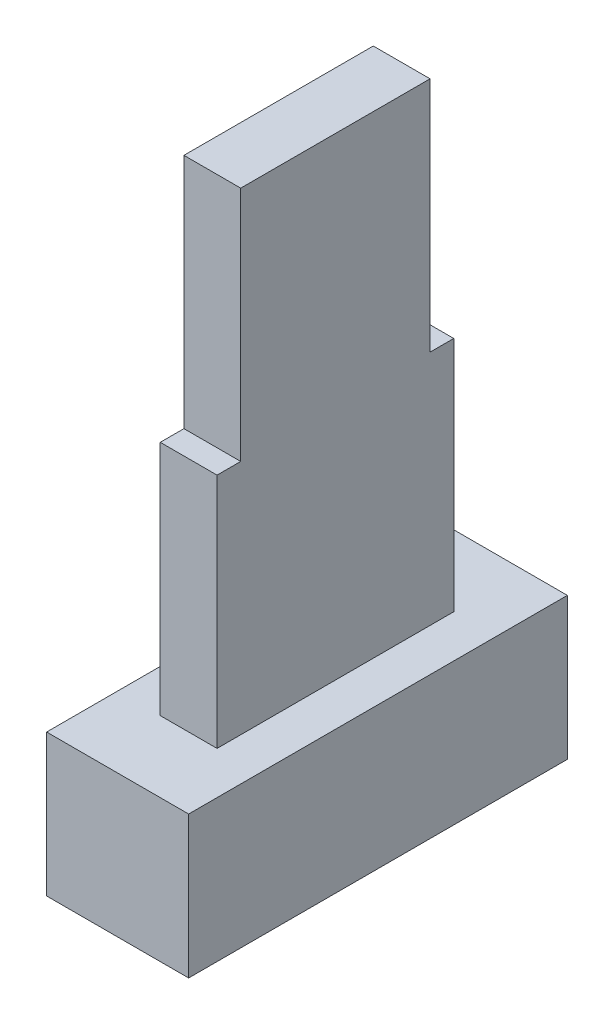
ISO-10303-21;
HEADER;
FILE_DESCRIPTION(('STEP AP214'),'2;1');
FILE_NAME('part.step','',(''),(''),'','','');
FILE_SCHEMA(('AUTOMOTIVE_DESIGN { 1 0 10303 214 1 1 1 1 }'));
ENDSEC;
DATA;
#1=APPLICATION_CONTEXT('core data for automotive mechanical design processes');
#2=APPLICATION_PROTOCOL_DEFINITION('international standard','automotive_design',2000,#1);
#3=PRODUCT_CONTEXT('',#1,'mechanical');
#4=PRODUCT('Part','Part','',(#3));
#5=PRODUCT_RELATED_PRODUCT_CATEGORY('part','',(#4));
#6=PRODUCT_DEFINITION_FORMATION('','',#4);
#7=PRODUCT_DEFINITION_CONTEXT('part definition',#1,'design');
#8=PRODUCT_DEFINITION('design','',#6,#7);
#9=PRODUCT_DEFINITION_SHAPE('','',#8);
#10=(LENGTH_UNIT() NAMED_UNIT(*) SI_UNIT(.MILLI.,.METRE.));
#11=(NAMED_UNIT(*) PLANE_ANGLE_UNIT() SI_UNIT($,.RADIAN.));
#12=(NAMED_UNIT(*) SI_UNIT($,.STERADIAN.) SOLID_ANGLE_UNIT());
#13=UNCERTAINTY_MEASURE_WITH_UNIT(LENGTH_MEASURE(1.E-05),#10,'distance_accuracy_value','');
#14=(GEOMETRIC_REPRESENTATION_CONTEXT(3) GLOBAL_UNCERTAINTY_ASSIGNED_CONTEXT((#13)) GLOBAL_UNIT_ASSIGNED_CONTEXT((#10,
#11,#12)) REPRESENTATION_CONTEXT('',''));
#15=CARTESIAN_POINT('',(0.,0.,0.));
#16=DIRECTION('',(0.,0.,1.));
#17=DIRECTION('',(1.,0.,0.));
#18=AXIS2_PLACEMENT_3D('',#15,#16,#17);
#19=CARTESIAN_POINT('',(0.,8.,0.));
#20=DIRECTION('',(0.,1.,0.));
#21=DIRECTION('',(0.,0.,1.));
#22=AXIS2_PLACEMENT_3D('',#19,#20,#21);
#23=PLANE('',#22);
#24=DIRECTION('',(-1.,0.,0.));
#25=VECTOR('',#24,1.);
#26=CARTESIAN_POINT('',(0.6,8.,-2.));
#27=LINE('',#26,#25);
#28=CARTESIAN_POINT('',(0.6,8.,-2.));
#29=VERTEX_POINT('',#28);
#30=CARTESIAN_POINT('',(-0.6,8.,-2.));
#31=VERTEX_POINT('',#30);
#32=EDGE_CURVE('E48',#29,#31,#27,.T.);
#33=ORIENTED_EDGE('',*,*,#32,.F.);
#34=DIRECTION('',(0.,0.,-1.));
#35=VECTOR('',#34,1.);
#36=CARTESIAN_POINT('',(0.6,8.,2.5));
#37=LINE('',#36,#35);
#38=CARTESIAN_POINT('',(0.6,8.,-2.5));
#39=VERTEX_POINT('',#38);
#40=EDGE_CURVE('E158',#29,#39,#37,.T.);
#41=ORIENTED_EDGE('',*,*,#40,.T.);
#42=DIRECTION('',(-1.,0.,0.));
#43=VECTOR('',#42,1.);
#44=CARTESIAN_POINT('',(0.6,8.,-2.5));
#45=LINE('',#44,#43);
#46=CARTESIAN_POINT('',(-0.6,8.,-2.5));
#47=VERTEX_POINT('',#46);
#48=EDGE_CURVE('E161',#39,#47,#45,.T.);
#49=ORIENTED_EDGE('',*,*,#48,.T.);
#50=DIRECTION('',(0.,0.,1.));
#51=VECTOR('',#50,1.);
#52=CARTESIAN_POINT('',(-0.6,8.,2.5));
#53=LINE('',#52,#51);
#54=EDGE_CURVE('E154',#47,#31,#53,.T.);
#55=ORIENTED_EDGE('',*,*,#54,.T.);
#56=EDGE_LOOP('',(#33,#41,#49,#55));
#57=FACE_BOUND('',#56,.T.);
#58=ADVANCED_FACE('F33',(#57),#23,.T.);
#59=CARTESIAN_POINT('',(0.,3.,0.));
#60=DIRECTION('',(0.,-1.,0.));
#61=DIRECTION('',(0.,0.,-1.));
#62=AXIS2_PLACEMENT_3D('',#59,#60,#61);
#63=PLANE('',#62);
#64=DIRECTION('',(0.,0.,-1.));
#65=VECTOR('',#64,1.);
#66=CARTESIAN_POINT('',(1.5,3.,4.));
#67=LINE('',#66,#65);
#68=CARTESIAN_POINT('',(1.5,3.,4.));
#69=VERTEX_POINT('',#68);
#70=CARTESIAN_POINT('',(1.5,3.,-4.));
#71=VERTEX_POINT('',#70);
#72=EDGE_CURVE('E184',#69,#71,#67,.T.);
#73=ORIENTED_EDGE('',*,*,#72,.T.);
#74=DIRECTION('',(-1.,0.,0.));
#75=VECTOR('',#74,1.);
#76=CARTESIAN_POINT('',(-1.5,3.,-4.));
#77=LINE('',#76,#75);
#78=CARTESIAN_POINT('',(-1.5,3.,-4.));
#79=VERTEX_POINT('',#78);
#80=EDGE_CURVE('E187',#71,#79,#77,.T.);
#81=ORIENTED_EDGE('',*,*,#80,.T.);
#82=DIRECTION('',(0.,0.,1.));
#83=VECTOR('',#82,1.);
#84=CARTESIAN_POINT('',(-1.5,3.,4.));
#85=LINE('',#84,#83);
#86=CARTESIAN_POINT('',(-1.5,3.,4.));
#87=VERTEX_POINT('',#86);
#88=EDGE_CURVE('E190',#79,#87,#85,.T.);
#89=ORIENTED_EDGE('',*,*,#88,.T.);
#90=DIRECTION('',(1.,0.,0.));
#91=VECTOR('',#90,1.);
#92=CARTESIAN_POINT('',(-1.5,3.,4.));
#93=LINE('',#92,#91);
#94=EDGE_CURVE('E192',#87,#69,#93,.T.);
#95=ORIENTED_EDGE('',*,*,#94,.T.);
#96=EDGE_LOOP('',(#73,#81,#89,#95));
#97=FACE_BOUND('',#96,.T.);
#98=DIRECTION('',(0.,0.,1.));
#99=VECTOR('',#98,1.);
#100=CARTESIAN_POINT('',(-0.6,3.,2.5));
#101=LINE('',#100,#99);
#102=CARTESIAN_POINT('',(-0.6,3.,-2.5));
#103=VERTEX_POINT('',#102);
#104=CARTESIAN_POINT('',(-0.6,3.,2.5));
#105=VERTEX_POINT('',#104);
#106=EDGE_CURVE('E146',#103,#105,#101,.T.);
#107=ORIENTED_EDGE('',*,*,#106,.F.);
#108=DIRECTION('',(-1.,0.,0.));
#109=VECTOR('',#108,1.);
#110=CARTESIAN_POINT('',(0.6,3.,-2.5));
#111=LINE('',#110,#109);
#112=CARTESIAN_POINT('',(0.6,3.,-2.5));
#113=VERTEX_POINT('',#112);
#114=EDGE_CURVE('E169',#113,#103,#111,.T.);
#115=ORIENTED_EDGE('',*,*,#114,.F.);
#116=DIRECTION('',(0.,0.,-1.));
#117=VECTOR('',#116,1.);
#118=CARTESIAN_POINT('',(0.6,3.,2.5));
#119=LINE('',#118,#117);
#120=CARTESIAN_POINT('',(0.6,3.,2.5));
#121=VERTEX_POINT('',#120);
#122=EDGE_CURVE('E166',#121,#113,#119,.T.);
#123=ORIENTED_EDGE('',*,*,#122,.F.);
#124=DIRECTION('',(1.,0.,0.));
#125=VECTOR('',#124,1.);
#126=CARTESIAN_POINT('',(0.6,3.,2.5));
#127=LINE('',#126,#125);
#128=EDGE_CURVE('E148',#105,#121,#127,.T.);
#129=ORIENTED_EDGE('',*,*,#128,.F.);
#130=EDGE_LOOP('',(#107,#115,#123,#129));
#131=FACE_BOUND('',#130,.T.);
#132=ADVANCED_FACE('F226',(#97,#131),#63,.F.);
#133=CARTESIAN_POINT('',(1.5,3.,4.));
#134=DIRECTION('',(-1.,0.,0.));
#135=DIRECTION('',(0.,0.,1.));
#136=AXIS2_PLACEMENT_3D('',#133,#134,#135);
#137=PLANE('',#136);
#138=DIRECTION('',(0.,0.,-1.));
#139=VECTOR('',#138,1.);
#140=CARTESIAN_POINT('',(1.5,0.,4.));
#141=LINE('',#140,#139);
#142=CARTESIAN_POINT('',(1.5,0.,4.));
#143=VERTEX_POINT('',#142);
#144=CARTESIAN_POINT('',(1.5,0.,-4.));
#145=VERTEX_POINT('',#144);
#146=EDGE_CURVE('E183',#143,#145,#141,.T.);
#147=ORIENTED_EDGE('',*,*,#146,.T.);
#148=DIRECTION('',(0.,-1.,0.));
#149=VECTOR('',#148,1.);
#150=CARTESIAN_POINT('',(1.5,3.,-4.));
#151=LINE('',#150,#149);
#152=EDGE_CURVE('E11',#71,#145,#151,.T.);
#153=ORIENTED_EDGE('',*,*,#152,.F.);
#154=ORIENTED_EDGE('',*,*,#72,.F.);
#155=DIRECTION('',(0.,-1.,0.));
#156=VECTOR('',#155,1.);
#157=CARTESIAN_POINT('',(1.5,3.,4.));
#158=LINE('',#157,#156);
#159=EDGE_CURVE('E194',#69,#143,#158,.T.);
#160=ORIENTED_EDGE('',*,*,#159,.T.);
#161=EDGE_LOOP('',(#147,#153,#154,#160));
#162=FACE_BOUND('',#161,.T.);
#163=ADVANCED_FACE('F35',(#162),#137,.F.);
#164=CARTESIAN_POINT('',(-1.5,3.,-4.));
#165=DIRECTION('',(0.,0.,1.));
#166=DIRECTION('',(1.,0.,0.));
#167=AXIS2_PLACEMENT_3D('',#164,#165,#166);
#168=PLANE('',#167);
#169=DIRECTION('',(-1.,0.,0.));
#170=VECTOR('',#169,1.);
#171=CARTESIAN_POINT('',(-1.5,0.,-4.));
#172=LINE('',#171,#170);
#173=CARTESIAN_POINT('',(-1.5,0.,-4.));
#174=VERTEX_POINT('',#173);
#175=EDGE_CURVE('E197',#145,#174,#172,.T.);
#176=ORIENTED_EDGE('',*,*,#175,.T.);
#177=DIRECTION('',(0.,-1.,0.));
#178=VECTOR('',#177,1.);
#179=CARTESIAN_POINT('',(-1.5,3.,-4.));
#180=LINE('',#179,#178);
#181=EDGE_CURVE('E41',#79,#174,#180,.T.);
#182=ORIENTED_EDGE('',*,*,#181,.F.);
#183=ORIENTED_EDGE('',*,*,#80,.F.);
#184=ORIENTED_EDGE('',*,*,#152,.T.);
#185=EDGE_LOOP('',(#176,#182,#183,#184));
#186=FACE_BOUND('',#185,.T.);
#187=ADVANCED_FACE('F228',(#186),#168,.F.);
#188=CARTESIAN_POINT('',(-1.5,3.,4.));
#189=DIRECTION('',(1.,0.,0.));
#190=DIRECTION('',(0.,0.,-1.));
#191=AXIS2_PLACEMENT_3D('',#188,#189,#190);
#192=PLANE('',#191);
#193=DIRECTION('',(0.,0.,1.));
#194=VECTOR('',#193,1.);
#195=CARTESIAN_POINT('',(-1.5,0.,4.));
#196=LINE('',#195,#194);
#197=CARTESIAN_POINT('',(-1.5,0.,4.));
#198=VERTEX_POINT('',#197);
#199=EDGE_CURVE('E199',#174,#198,#196,.T.);
#200=ORIENTED_EDGE('',*,*,#199,.T.);
#201=DIRECTION('',(0.,-1.,0.));
#202=VECTOR('',#201,1.);
#203=CARTESIAN_POINT('',(-1.5,3.,4.));
#204=LINE('',#203,#202);
#205=EDGE_CURVE('E204',#87,#198,#204,.T.);
#206=ORIENTED_EDGE('',*,*,#205,.F.);
#207=ORIENTED_EDGE('',*,*,#88,.F.);
#208=ORIENTED_EDGE('',*,*,#181,.T.);
#209=EDGE_LOOP('',(#200,#206,#207,#208));
#210=FACE_BOUND('',#209,.T.);
#211=ADVANCED_FACE('F211',(#210),#192,.F.);
#212=CARTESIAN_POINT('',(-1.5,3.,4.));
#213=DIRECTION('',(0.,0.,-1.));
#214=DIRECTION('',(-1.,0.,0.));
#215=AXIS2_PLACEMENT_3D('',#212,#213,#214);
#216=PLANE('',#215);
#217=DIRECTION('',(1.,0.,0.));
#218=VECTOR('',#217,1.);
#219=CARTESIAN_POINT('',(-1.5,0.,4.));
#220=LINE('',#219,#218);
#221=EDGE_CURVE('E188',#198,#143,#220,.T.);
#222=ORIENTED_EDGE('',*,*,#221,.T.);
#223=ORIENTED_EDGE('',*,*,#159,.F.);
#224=ORIENTED_EDGE('',*,*,#94,.F.);
#225=ORIENTED_EDGE('',*,*,#205,.T.);
#226=EDGE_LOOP('',(#222,#223,#224,#225));
#227=FACE_BOUND('',#226,.T.);
#228=ADVANCED_FACE('F220',(#227),#216,.F.);
#229=CARTESIAN_POINT('',(0.,0.,0.));
#230=DIRECTION('',(0.,-1.,0.));
#231=DIRECTION('',(0.,0.,-1.));
#232=AXIS2_PLACEMENT_3D('',#229,#230,#231);
#233=PLANE('',#232);
#234=ORIENTED_EDGE('',*,*,#146,.F.);
#235=ORIENTED_EDGE('',*,*,#221,.F.);
#236=ORIENTED_EDGE('',*,*,#199,.F.);
#237=ORIENTED_EDGE('',*,*,#175,.F.);
#238=EDGE_LOOP('',(#234,#235,#236,#237));
#239=FACE_BOUND('',#238,.T.);
#240=ADVANCED_FACE('F217',(#239),#233,.T.);
#241=CARTESIAN_POINT('',(-0.6,8.,2.5));
#242=DIRECTION('',(1.,0.,0.));
#243=DIRECTION('',(0.,0.,-1.));
#244=AXIS2_PLACEMENT_3D('',#241,#242,#243);
#245=PLANE('',#244);
#246=ORIENTED_EDGE('',*,*,#106,.T.);
#247=DIRECTION('',(0.,-1.,0.));
#248=VECTOR('',#247,1.);
#249=CARTESIAN_POINT('',(-0.6,8.,2.5));
#250=LINE('',#249,#248);
#251=CARTESIAN_POINT('',(-0.6,8.,2.5));
#252=VERTEX_POINT('',#251);
#253=EDGE_CURVE('E180',#252,#105,#250,.T.);
#254=ORIENTED_EDGE('',*,*,#253,.F.);
#255=CARTESIAN_POINT('',(-0.6,8.,2.));
#256=VERTEX_POINT('',#255);
#257=EDGE_CURVE('E145',#256,#252,#53,.T.);
#258=ORIENTED_EDGE('',*,*,#257,.F.);
#259=DIRECTION('',(0.,-1.,0.));
#260=VECTOR('',#259,1.);
#261=CARTESIAN_POINT('',(-0.6,13.,2.));
#262=LINE('',#261,#260);
#263=CARTESIAN_POINT('',(-0.6,13.,2.));
#264=VERTEX_POINT('',#263);
#265=EDGE_CURVE('E126',#264,#256,#262,.T.);
#266=ORIENTED_EDGE('',*,*,#265,.F.);
#267=DIRECTION('',(0.,0.,1.));
#268=VECTOR('',#267,1.);
#269=CARTESIAN_POINT('',(-0.6,13.,2.));
#270=LINE('',#269,#268);
#271=CARTESIAN_POINT('',(-0.6,13.,-2.));
#272=VERTEX_POINT('',#271);
#273=EDGE_CURVE('E132',#272,#264,#270,.T.);
#274=ORIENTED_EDGE('',*,*,#273,.F.);
#275=DIRECTION('',(0.,-1.,0.));
#276=VECTOR('',#275,1.);
#277=CARTESIAN_POINT('',(-0.6,13.,-2.));
#278=LINE('',#277,#276);
#279=EDGE_CURVE('E324',#272,#31,#278,.T.);
#280=ORIENTED_EDGE('',*,*,#279,.T.);
#281=ORIENTED_EDGE('',*,*,#54,.F.);
#282=DIRECTION('',(0.,-1.,0.));
#283=VECTOR('',#282,1.);
#284=CARTESIAN_POINT('',(-0.6,8.,-2.5));
#285=LINE('',#284,#283);
#286=EDGE_CURVE('E162',#47,#103,#285,.T.);
#287=ORIENTED_EDGE('',*,*,#286,.T.);
#288=EDGE_LOOP('',(#246,#254,#258,#266,#274,#280,#281,#287));
#289=FACE_BOUND('',#288,.T.);
#290=ADVANCED_FACE('F143',(#289),#245,.F.);
#291=CARTESIAN_POINT('',(0.6,8.,2.5));
#292=DIRECTION('',(0.,0.,-1.));
#293=DIRECTION('',(-1.,0.,0.));
#294=AXIS2_PLACEMENT_3D('',#291,#292,#293);
#295=PLANE('',#294);
#296=ORIENTED_EDGE('',*,*,#128,.T.);
#297=DIRECTION('',(0.,-1.,0.));
#298=VECTOR('',#297,1.);
#299=CARTESIAN_POINT('',(0.6,8.,2.5));
#300=LINE('',#299,#298);
#301=CARTESIAN_POINT('',(0.6,8.,2.5));
#302=VERTEX_POINT('',#301);
#303=EDGE_CURVE('E177',#302,#121,#300,.T.);
#304=ORIENTED_EDGE('',*,*,#303,.F.);
#305=DIRECTION('',(1.,0.,0.));
#306=VECTOR('',#305,1.);
#307=CARTESIAN_POINT('',(0.6,8.,2.5));
#308=LINE('',#307,#306);
#309=EDGE_CURVE('E156',#252,#302,#308,.T.);
#310=ORIENTED_EDGE('',*,*,#309,.F.);
#311=ORIENTED_EDGE('',*,*,#253,.T.);
#312=EDGE_LOOP('',(#296,#304,#310,#311));
#313=FACE_BOUND('',#312,.T.);
#314=ADVANCED_FACE('F256',(#313),#295,.F.);
#315=CARTESIAN_POINT('',(0.6,8.,2.5));
#316=DIRECTION('',(-1.,0.,0.));
#317=DIRECTION('',(0.,0.,1.));
#318=AXIS2_PLACEMENT_3D('',#315,#316,#317);
#319=PLANE('',#318);
#320=ORIENTED_EDGE('',*,*,#122,.T.);
#321=DIRECTION('',(0.,-1.,0.));
#322=VECTOR('',#321,1.);
#323=CARTESIAN_POINT('',(0.6,8.,-2.5));
#324=LINE('',#323,#322);
#325=EDGE_CURVE('E174',#39,#113,#324,.T.);
#326=ORIENTED_EDGE('',*,*,#325,.F.);
#327=ORIENTED_EDGE('',*,*,#40,.F.);
#328=DIRECTION('',(0.,-1.,0.));
#329=VECTOR('',#328,1.);
#330=CARTESIAN_POINT('',(0.6,13.,-2.));
#331=LINE('',#330,#329);
#332=CARTESIAN_POINT('',(0.6,13.,-2.));
#333=VERTEX_POINT('',#332);
#334=EDGE_CURVE('E150',#333,#29,#331,.T.);
#335=ORIENTED_EDGE('',*,*,#334,.F.);
#336=DIRECTION('',(0.,0.,-1.));
#337=VECTOR('',#336,1.);
#338=CARTESIAN_POINT('',(0.6,13.,2.));
#339=LINE('',#338,#337);
#340=CARTESIAN_POINT('',(0.6,13.,2.));
#341=VERTEX_POINT('',#340);
#342=EDGE_CURVE('E131',#341,#333,#339,.T.);
#343=ORIENTED_EDGE('',*,*,#342,.F.);
#344=DIRECTION('',(0.,-1.,0.));
#345=VECTOR('',#344,1.);
#346=CARTESIAN_POINT('',(0.6,13.,2.));
#347=LINE('',#346,#345);
#348=CARTESIAN_POINT('',(0.6,8.,2.));
#349=VERTEX_POINT('',#348);
#350=EDGE_CURVE('E128',#341,#349,#347,.T.);
#351=ORIENTED_EDGE('',*,*,#350,.T.);
#352=EDGE_CURVE('E159',#302,#349,#37,.T.);
#353=ORIENTED_EDGE('',*,*,#352,.F.);
#354=ORIENTED_EDGE('',*,*,#303,.T.);
#355=EDGE_LOOP('',(#320,#326,#327,#335,#343,#351,#353,#354));
#356=FACE_BOUND('',#355,.T.);
#357=ADVANCED_FACE('F251',(#356),#319,.F.);
#358=CARTESIAN_POINT('',(0.6,8.,-2.5));
#359=DIRECTION('',(0.,0.,1.));
#360=DIRECTION('',(1.,0.,0.));
#361=AXIS2_PLACEMENT_3D('',#358,#359,#360);
#362=PLANE('',#361);
#363=ORIENTED_EDGE('',*,*,#114,.T.);
#364=ORIENTED_EDGE('',*,*,#286,.F.);
#365=ORIENTED_EDGE('',*,*,#48,.F.);
#366=ORIENTED_EDGE('',*,*,#325,.T.);
#367=EDGE_LOOP('',(#363,#364,#365,#366));
#368=FACE_BOUND('',#367,.T.);
#369=ADVANCED_FACE('F245',(#368),#362,.F.);
#370=DIRECTION('',(1.,0.,0.));
#371=VECTOR('',#370,1.);
#372=CARTESIAN_POINT('',(0.6,8.,2.));
#373=LINE('',#372,#371);
#374=EDGE_CURVE('E56',#256,#349,#373,.T.);
#375=ORIENTED_EDGE('',*,*,#374,.F.);
#376=ORIENTED_EDGE('',*,*,#257,.T.);
#377=ORIENTED_EDGE('',*,*,#309,.T.);
#378=ORIENTED_EDGE('',*,*,#352,.T.);
#379=EDGE_LOOP('',(#375,#376,#377,#378));
#380=FACE_BOUND('',#379,.T.);
#381=ADVANCED_FACE('F237',(#380),#23,.T.);
#382=CARTESIAN_POINT('',(0.6,13.,2.));
#383=DIRECTION('',(0.,0.,-1.));
#384=DIRECTION('',(-1.,0.,0.));
#385=AXIS2_PLACEMENT_3D('',#382,#383,#384);
#386=PLANE('',#385);
#387=ORIENTED_EDGE('',*,*,#374,.T.);
#388=ORIENTED_EDGE('',*,*,#350,.F.);
#389=DIRECTION('',(1.,0.,0.));
#390=VECTOR('',#389,1.);
#391=CARTESIAN_POINT('',(0.6,13.,2.));
#392=LINE('',#391,#390);
#393=EDGE_CURVE('E122',#264,#341,#392,.T.);
#394=ORIENTED_EDGE('',*,*,#393,.F.);
#395=ORIENTED_EDGE('',*,*,#265,.T.);
#396=EDGE_LOOP('',(#387,#388,#394,#395));
#397=FACE_BOUND('',#396,.T.);
#398=ADVANCED_FACE('F124',(#397),#386,.F.);
#399=CARTESIAN_POINT('',(0.6,13.,-2.));
#400=DIRECTION('',(0.,0.,1.));
#401=DIRECTION('',(1.,0.,0.));
#402=AXIS2_PLACEMENT_3D('',#399,#400,#401);
#403=PLANE('',#402);
#404=ORIENTED_EDGE('',*,*,#32,.T.);
#405=ORIENTED_EDGE('',*,*,#279,.F.);
#406=DIRECTION('',(-1.,0.,0.));
#407=VECTOR('',#406,1.);
#408=CARTESIAN_POINT('',(0.6,13.,-2.));
#409=LINE('',#408,#407);
#410=EDGE_CURVE('E137',#333,#272,#409,.T.);
#411=ORIENTED_EDGE('',*,*,#410,.F.);
#412=ORIENTED_EDGE('',*,*,#334,.T.);
#413=EDGE_LOOP('',(#404,#405,#411,#412));
#414=FACE_BOUND('',#413,.T.);
#415=ADVANCED_FACE('F250',(#414),#403,.F.);
#416=CARTESIAN_POINT('',(0.,13.,0.));
#417=DIRECTION('',(0.,1.,0.));
#418=DIRECTION('',(0.,0.,1.));
#419=AXIS2_PLACEMENT_3D('',#416,#417,#418);
#420=PLANE('',#419);
#421=ORIENTED_EDGE('',*,*,#273,.T.);
#422=ORIENTED_EDGE('',*,*,#393,.T.);
#423=ORIENTED_EDGE('',*,*,#342,.T.);
#424=ORIENTED_EDGE('',*,*,#410,.T.);
#425=EDGE_LOOP('',(#421,#422,#423,#424));
#426=FACE_BOUND('',#425,.T.);
#427=ADVANCED_FACE('F135',(#426),#420,.T.);
#428=CLOSED_SHELL('',(#58,#132,#163,#187,#211,#228,#240,#290,#314,#357,#369,#381,#398,#415,#427));
#429=MANIFOLD_SOLID_BREP('B2',#428);
#430=ADVANCED_BREP_SHAPE_REPRESENTATION('',(#18,#429),#14);
#431=SHAPE_DEFINITION_REPRESENTATION(#9,#430);
ENDSEC;
END-ISO-10303-21;
